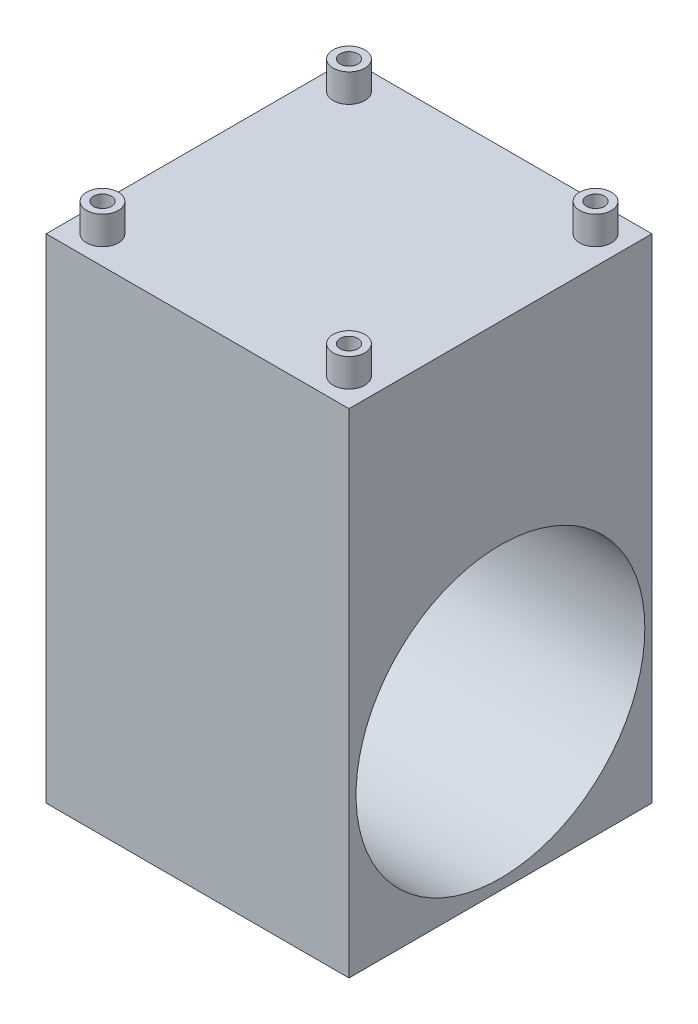
ISO-10303-21;
HEADER;
FILE_DESCRIPTION(('STEP AP214'),'2;1');
FILE_NAME('part.step','',(''),(''),'','','');
FILE_SCHEMA(('AUTOMOTIVE_DESIGN { 1 0 10303 214 1 1 1 1 }'));
ENDSEC;
DATA;
#1=APPLICATION_CONTEXT('core data for automotive mechanical design processes');
#2=APPLICATION_PROTOCOL_DEFINITION('international standard','automotive_design',2000,#1);
#3=PRODUCT_CONTEXT('',#1,'mechanical');
#4=PRODUCT('Part','Part','',(#3));
#5=PRODUCT_RELATED_PRODUCT_CATEGORY('part','',(#4));
#6=PRODUCT_DEFINITION_FORMATION('','',#4);
#7=PRODUCT_DEFINITION_CONTEXT('part definition',#1,'design');
#8=PRODUCT_DEFINITION('design','',#6,#7);
#9=PRODUCT_DEFINITION_SHAPE('','',#8);
#10=(LENGTH_UNIT() NAMED_UNIT(*) SI_UNIT(.MILLI.,.METRE.));
#11=(NAMED_UNIT(*) PLANE_ANGLE_UNIT() SI_UNIT($,.RADIAN.));
#12=(NAMED_UNIT(*) SI_UNIT($,.STERADIAN.) SOLID_ANGLE_UNIT());
#13=UNCERTAINTY_MEASURE_WITH_UNIT(LENGTH_MEASURE(1.E-05),#10,'distance_accuracy_value','');
#14=(GEOMETRIC_REPRESENTATION_CONTEXT(3) GLOBAL_UNCERTAINTY_ASSIGNED_CONTEXT((#13)) GLOBAL_UNIT_ASSIGNED_CONTEXT((#10,
#11,#12)) REPRESENTATION_CONTEXT('',''));
#15=CARTESIAN_POINT('',(0.,0.,0.));
#16=DIRECTION('',(0.,0.,1.));
#17=DIRECTION('',(1.,0.,0.));
#18=AXIS2_PLACEMENT_3D('',#15,#16,#17);
#19=CARTESIAN_POINT('',(21.5,70.,-21.5));
#20=DIRECTION('',(-1.,0.,0.));
#21=DIRECTION('',(0.,0.,1.));
#22=AXIS2_PLACEMENT_3D('',#19,#20,#21);
#23=PLANE('',#22);
#24=CARTESIAN_POINT('',(21.5,22.,0.));
#25=DIRECTION('',(1.,0.,0.));
#26=DIRECTION('',(0.,0.,-1.));
#27=AXIS2_PLACEMENT_3D('',#24,#25,#26);
#28=CIRCLE('',#27,20.5);
#29=CARTESIAN_POINT('',(21.5,22.,-20.5));
#30=VERTEX_POINT('',#29);
#31=EDGE_CURVE('E163',#30,#30,#28,.T.);
#32=ORIENTED_EDGE('',*,*,#31,.F.);
#33=EDGE_LOOP('',(#32));
#34=FACE_BOUND('',#33,.T.);
#35=DIRECTION('',(0.,0.,-1.));
#36=VECTOR('',#35,1.);
#37=CARTESIAN_POINT('',(21.5,0.,-21.5));
#38=LINE('',#37,#36);
#39=CARTESIAN_POINT('',(21.5,0.,21.5));
#40=VERTEX_POINT('',#39);
#41=CARTESIAN_POINT('',(21.5,0.,-21.5));
#42=VERTEX_POINT('',#41);
#43=EDGE_CURVE('E109',#40,#42,#38,.T.);
#44=ORIENTED_EDGE('',*,*,#43,.T.);
#45=DIRECTION('',(0.,-1.,0.));
#46=VECTOR('',#45,1.);
#47=CARTESIAN_POINT('',(21.5,70.,-21.5));
#48=LINE('',#47,#46);
#49=CARTESIAN_POINT('',(21.5,70.,-21.5));
#50=VERTEX_POINT('',#49);
#51=EDGE_CURVE('E100',#50,#42,#48,.T.);
#52=ORIENTED_EDGE('',*,*,#51,.F.);
#53=DIRECTION('',(0.,0.,-1.));
#54=VECTOR('',#53,1.);
#55=CARTESIAN_POINT('',(21.5,70.,-21.5));
#56=LINE('',#55,#54);
#57=CARTESIAN_POINT('',(21.5,70.,21.5));
#58=VERTEX_POINT('',#57);
#59=EDGE_CURVE('E94',#58,#50,#56,.T.);
#60=ORIENTED_EDGE('',*,*,#59,.F.);
#61=DIRECTION('',(0.,-1.,0.));
#62=VECTOR('',#61,1.);
#63=CARTESIAN_POINT('',(21.5,70.,21.5));
#64=LINE('',#63,#62);
#65=EDGE_CURVE('E105',#58,#40,#64,.T.);
#66=ORIENTED_EDGE('',*,*,#65,.T.);
#67=EDGE_LOOP('',(#44,#52,#60,#66));
#68=FACE_BOUND('',#67,.T.);
#69=ADVANCED_FACE('F42',(#34,#68),#23,.F.);
#70=CARTESIAN_POINT('',(-21.5,70.,-21.5));
#71=DIRECTION('',(0.,0.,1.));
#72=DIRECTION('',(1.,0.,0.));
#73=AXIS2_PLACEMENT_3D('',#70,#71,#72);
#74=PLANE('',#73);
#75=DIRECTION('',(-1.,0.,0.));
#76=VECTOR('',#75,1.);
#77=CARTESIAN_POINT('',(-21.5,0.,-21.5));
#78=LINE('',#77,#76);
#79=CARTESIAN_POINT('',(-21.5,0.,-21.5));
#80=VERTEX_POINT('',#79);
#81=EDGE_CURVE('E99',#42,#80,#78,.T.);
#82=ORIENTED_EDGE('',*,*,#81,.T.);
#83=DIRECTION('',(0.,-1.,0.));
#84=VECTOR('',#83,1.);
#85=CARTESIAN_POINT('',(-21.5,70.,-21.5));
#86=LINE('',#85,#84);
#87=CARTESIAN_POINT('',(-21.5,70.,-21.5));
#88=VERTEX_POINT('',#87);
#89=EDGE_CURVE('E97',#88,#80,#86,.T.);
#90=ORIENTED_EDGE('',*,*,#89,.F.);
#91=DIRECTION('',(-1.,0.,0.));
#92=VECTOR('',#91,1.);
#93=CARTESIAN_POINT('',(-21.5,70.,-21.5));
#94=LINE('',#93,#92);
#95=EDGE_CURVE('E89',#50,#88,#94,.T.);
#96=ORIENTED_EDGE('',*,*,#95,.F.);
#97=ORIENTED_EDGE('',*,*,#51,.T.);
#98=EDGE_LOOP('',(#82,#90,#96,#97));
#99=FACE_BOUND('',#98,.T.);
#100=ADVANCED_FACE('F98',(#99),#74,.F.);
#101=CARTESIAN_POINT('',(-21.5,70.,-21.5));
#102=DIRECTION('',(1.,0.,0.));
#103=DIRECTION('',(0.,0.,-1.));
#104=AXIS2_PLACEMENT_3D('',#101,#102,#103);
#105=PLANE('',#104);
#106=DIRECTION('',(0.,0.,1.));
#107=VECTOR('',#106,1.);
#108=CARTESIAN_POINT('',(-21.5,0.,-21.5));
#109=LINE('',#108,#107);
#110=CARTESIAN_POINT('',(-21.5,0.,21.5));
#111=VERTEX_POINT('',#110);
#112=EDGE_CURVE('E75',#80,#111,#109,.T.);
#113=ORIENTED_EDGE('',*,*,#112,.T.);
#114=DIRECTION('',(0.,-1.,0.));
#115=VECTOR('',#114,1.);
#116=CARTESIAN_POINT('',(-21.5,70.,21.5));
#117=LINE('',#116,#115);
#118=CARTESIAN_POINT('',(-21.5,70.,21.5));
#119=VERTEX_POINT('',#118);
#120=EDGE_CURVE('E101',#119,#111,#117,.T.);
#121=ORIENTED_EDGE('',*,*,#120,.F.);
#122=DIRECTION('',(0.,0.,1.));
#123=VECTOR('',#122,1.);
#124=CARTESIAN_POINT('',(-21.5,70.,-21.5));
#125=LINE('',#124,#123);
#126=EDGE_CURVE('E92',#88,#119,#125,.T.);
#127=ORIENTED_EDGE('',*,*,#126,.F.);
#128=ORIENTED_EDGE('',*,*,#89,.T.);
#129=EDGE_LOOP('',(#113,#121,#127,#128));
#130=FACE_BOUND('',#129,.T.);
#131=ADVANCED_FACE('F103',(#130),#105,.F.);
#132=CARTESIAN_POINT('',(-21.5,70.,21.5));
#133=DIRECTION('',(0.,0.,-1.));
#134=DIRECTION('',(-1.,0.,0.));
#135=AXIS2_PLACEMENT_3D('',#132,#133,#134);
#136=PLANE('',#135);
#137=DIRECTION('',(1.,0.,0.));
#138=VECTOR('',#137,1.);
#139=CARTESIAN_POINT('',(-21.5,0.,21.5));
#140=LINE('',#139,#138);
#141=EDGE_CURVE('E81',#111,#40,#140,.T.);
#142=ORIENTED_EDGE('',*,*,#141,.T.);
#143=ORIENTED_EDGE('',*,*,#65,.F.);
#144=DIRECTION('',(1.,0.,0.));
#145=VECTOR('',#144,1.);
#146=CARTESIAN_POINT('',(-21.5,70.,21.5));
#147=LINE('',#146,#145);
#148=EDGE_CURVE('E58',#119,#58,#147,.T.);
#149=ORIENTED_EDGE('',*,*,#148,.F.);
#150=ORIENTED_EDGE('',*,*,#120,.T.);
#151=EDGE_LOOP('',(#142,#143,#149,#150));
#152=FACE_BOUND('',#151,.T.);
#153=ADVANCED_FACE('F175',(#152),#136,.F.);
#154=CARTESIAN_POINT('',(0.,70.,0.));
#155=DIRECTION('',(0.,1.,0.));
#156=DIRECTION('',(0.,0.,1.));
#157=AXIS2_PLACEMENT_3D('',#154,#155,#156);
#158=PLANE('',#157);
#159=CARTESIAN_POINT('',(17.5,70.,17.5));
#160=DIRECTION('',(0.,1.,0.));
#161=DIRECTION('',(0.,0.,1.));
#162=AXIS2_PLACEMENT_3D('',#159,#160,#161);
#163=CIRCLE('',#162,2.24999999999999);
#164=CARTESIAN_POINT('',(17.5,70.,19.75));
#165=VERTEX_POINT('',#164);
#166=EDGE_CURVE('E442',#165,#165,#163,.T.);
#167=ORIENTED_EDGE('',*,*,#166,.F.);
#168=EDGE_LOOP('',(#167));
#169=FACE_BOUND('',#168,.T.);
#170=CARTESIAN_POINT('',(-17.5,70.,17.5));
#171=DIRECTION('',(0.,1.,0.));
#172=DIRECTION('',(0.,0.,1.));
#173=AXIS2_PLACEMENT_3D('',#170,#171,#172);
#174=CIRCLE('',#173,2.25000000000001);
#175=CARTESIAN_POINT('',(-17.5,70.,19.75));
#176=VERTEX_POINT('',#175);
#177=EDGE_CURVE('E433',#176,#176,#174,.T.);
#178=ORIENTED_EDGE('',*,*,#177,.F.);
#179=EDGE_LOOP('',(#178));
#180=FACE_BOUND('',#179,.T.);
#181=CARTESIAN_POINT('',(-17.5,70.,-17.5));
#182=DIRECTION('',(0.,1.,0.));
#183=DIRECTION('',(0.,0.,1.));
#184=AXIS2_PLACEMENT_3D('',#181,#182,#183);
#185=CIRCLE('',#184,2.25);
#186=CARTESIAN_POINT('',(-17.5,70.,-15.25));
#187=VERTEX_POINT('',#186);
#188=EDGE_CURVE('E424',#187,#187,#185,.T.);
#189=ORIENTED_EDGE('',*,*,#188,.F.);
#190=EDGE_LOOP('',(#189));
#191=FACE_BOUND('',#190,.T.);
#192=CARTESIAN_POINT('',(17.5,70.,-17.5));
#193=DIRECTION('',(0.,1.,0.));
#194=DIRECTION('',(0.,0.,1.));
#195=AXIS2_PLACEMENT_3D('',#192,#193,#194);
#196=CIRCLE('',#195,2.24999999999999);
#197=CARTESIAN_POINT('',(17.5,70.,-15.25));
#198=VERTEX_POINT('',#197);
#199=EDGE_CURVE('E413',#198,#198,#196,.T.);
#200=ORIENTED_EDGE('',*,*,#199,.F.);
#201=EDGE_LOOP('',(#200));
#202=FACE_BOUND('',#201,.T.);
#203=ORIENTED_EDGE('',*,*,#59,.T.);
#204=ORIENTED_EDGE('',*,*,#95,.T.);
#205=ORIENTED_EDGE('',*,*,#126,.T.);
#206=ORIENTED_EDGE('',*,*,#148,.T.);
#207=EDGE_LOOP('',(#203,#204,#205,#206));
#208=FACE_BOUND('',#207,.T.);
#209=ADVANCED_FACE('F90',(#169,#180,#191,#202,#208),#158,.T.);
#210=CARTESIAN_POINT('',(0.,0.,0.));
#211=DIRECTION('',(0.,1.,0.));
#212=DIRECTION('',(0.,0.,1.));
#213=AXIS2_PLACEMENT_3D('',#210,#211,#212);
#214=PLANE('',#213);
#215=ORIENTED_EDGE('',*,*,#43,.F.);
#216=ORIENTED_EDGE('',*,*,#141,.F.);
#217=ORIENTED_EDGE('',*,*,#112,.F.);
#218=ORIENTED_EDGE('',*,*,#81,.F.);
#219=EDGE_LOOP('',(#215,#216,#217,#218));
#220=FACE_BOUND('',#219,.T.);
#221=ADVANCED_FACE('F166',(#220),#214,.F.);
#222=CARTESIAN_POINT('',(-18.5,22.,0.));
#223=DIRECTION('',(1.,0.,0.));
#224=DIRECTION('',(0.,0.,-1.));
#225=AXIS2_PLACEMENT_3D('',#222,#223,#224);
#226=CYLINDRICAL_SURFACE('',#225,20.5);
#227=CARTESIAN_POINT('',(-18.5,22.,0.));
#228=DIRECTION('',(1.,0.,0.));
#229=DIRECTION('',(0.,0.,-1.));
#230=AXIS2_PLACEMENT_3D('',#227,#228,#229);
#231=CIRCLE('',#230,20.5);
#232=CARTESIAN_POINT('',(-18.5,22.,-20.5));
#233=VERTEX_POINT('',#232);
#234=EDGE_CURVE('E112',#233,#233,#231,.T.);
#235=ORIENTED_EDGE('',*,*,#234,.F.);
#236=EDGE_LOOP('',(#235));
#237=FACE_BOUND('',#236,.T.);
#238=ORIENTED_EDGE('',*,*,#31,.T.);
#239=EDGE_LOOP('',(#238));
#240=FACE_BOUND('',#239,.T.);
#241=ADVANCED_FACE('F168',(#237,#240),#226,.F.);
#242=CARTESIAN_POINT('',(-18.5,22.,0.));
#243=DIRECTION('',(1.,0.,0.));
#244=DIRECTION('',(0.,0.,-1.));
#245=AXIS2_PLACEMENT_3D('',#242,#243,#244);
#246=PLANE('',#245);
#247=ORIENTED_EDGE('',*,*,#234,.T.);
#248=EDGE_LOOP('',(#247));
#249=FACE_BOUND('',#248,.T.);
#250=ADVANCED_FACE('F173',(#249),#246,.T.);
#251=CARTESIAN_POINT('',(17.5,74.,-17.5));
#252=DIRECTION('',(0.,1.,0.));
#253=DIRECTION('',(0.,0.,1.));
#254=AXIS2_PLACEMENT_3D('',#251,#252,#253);
#255=PLANE('',#254);
#256=CARTESIAN_POINT('',(17.5,74.,-17.5));
#257=DIRECTION('',(0.,1.,0.));
#258=DIRECTION('',(0.,0.,1.));
#259=AXIS2_PLACEMENT_3D('',#256,#257,#258);
#260=CIRCLE('',#259,2.24999999999999);
#261=CARTESIAN_POINT('',(17.5,74.,-15.25));
#262=VERTEX_POINT('',#261);
#263=EDGE_CURVE('E410',#262,#262,#260,.T.);
#264=ORIENTED_EDGE('',*,*,#263,.T.);
#265=EDGE_LOOP('',(#264));
#266=FACE_BOUND('',#265,.T.);
#267=CARTESIAN_POINT('',(17.5,74.,-17.5));
#268=DIRECTION('',(0.,1.,0.));
#269=DIRECTION('',(0.,0.,1.));
#270=AXIS2_PLACEMENT_3D('',#267,#268,#269);
#271=CIRCLE('',#270,1.27);
#272=CARTESIAN_POINT('',(17.5,74.,-16.23));
#273=VERTEX_POINT('',#272);
#274=EDGE_CURVE('E416',#273,#273,#271,.T.);
#275=ORIENTED_EDGE('',*,*,#274,.F.);
#276=EDGE_LOOP('',(#275));
#277=FACE_BOUND('',#276,.T.);
#278=ADVANCED_FACE('F205',(#266,#277),#255,.T.);
#279=CARTESIAN_POINT('',(17.5,74.,-17.5));
#280=DIRECTION('',(0.,-1.,0.));
#281=DIRECTION('',(0.,0.,-1.));
#282=AXIS2_PLACEMENT_3D('',#279,#280,#281);
#283=CYLINDRICAL_SURFACE('',#282,2.24999999999999);
#284=ORIENTED_EDGE('',*,*,#263,.F.);
#285=EDGE_LOOP('',(#284));
#286=FACE_BOUND('',#285,.T.);
#287=ORIENTED_EDGE('',*,*,#199,.T.);
#288=EDGE_LOOP('',(#287));
#289=FACE_BOUND('',#288,.T.);
#290=ADVANCED_FACE('F210',(#286,#289),#283,.T.);
#291=CARTESIAN_POINT('',(17.5,74.,-17.5));
#292=DIRECTION('',(0.,-1.,0.));
#293=DIRECTION('',(0.,0.,-1.));
#294=AXIS2_PLACEMENT_3D('',#291,#292,#293);
#295=CYLINDRICAL_SURFACE('',#294,1.27);
#296=ORIENTED_EDGE('',*,*,#274,.T.);
#297=EDGE_LOOP('',(#296));
#298=FACE_BOUND('',#297,.T.);
#299=CARTESIAN_POINT('',(17.5,70.,-17.5));
#300=DIRECTION('',(0.,1.,0.));
#301=DIRECTION('',(0.,0.,1.));
#302=AXIS2_PLACEMENT_3D('',#299,#300,#301);
#303=CIRCLE('',#302,1.27);
#304=CARTESIAN_POINT('',(17.5,70.,-16.23));
#305=VERTEX_POINT('',#304);
#306=EDGE_CURVE('E119',#305,#305,#303,.F.);
#307=ORIENTED_EDGE('',*,*,#306,.T.);
#308=EDGE_LOOP('',(#307));
#309=FACE_BOUND('',#308,.T.);
#310=ADVANCED_FACE('F222',(#298,#309),#295,.F.);
#311=ORIENTED_EDGE('',*,*,#306,.F.);
#312=EDGE_LOOP('',(#311));
#313=FACE_BOUND('',#312,.T.);
#314=ADVANCED_FACE('F151',(#313),#158,.T.);
#315=CARTESIAN_POINT('',(-17.5,74.,-17.5));
#316=DIRECTION('',(0.,1.,0.));
#317=DIRECTION('',(0.,0.,1.));
#318=AXIS2_PLACEMENT_3D('',#315,#316,#317);
#319=PLANE('',#318);
#320=CARTESIAN_POINT('',(-17.5,74.,-17.5));
#321=DIRECTION('',(0.,1.,0.));
#322=DIRECTION('',(0.,0.,1.));
#323=AXIS2_PLACEMENT_3D('',#320,#321,#322);
#324=CIRCLE('',#323,2.25);
#325=CARTESIAN_POINT('',(-17.5,74.,-15.25));
#326=VERTEX_POINT('',#325);
#327=EDGE_CURVE('E425',#326,#326,#324,.T.);
#328=ORIENTED_EDGE('',*,*,#327,.T.);
#329=EDGE_LOOP('',(#328));
#330=FACE_BOUND('',#329,.T.);
#331=CARTESIAN_POINT('',(-17.5,74.,-17.5));
#332=DIRECTION('',(0.,1.,0.));
#333=DIRECTION('',(0.,0.,1.));
#334=AXIS2_PLACEMENT_3D('',#331,#332,#333);
#335=CIRCLE('',#334,1.27);
#336=CARTESIAN_POINT('',(-17.5,74.,-16.23));
#337=VERTEX_POINT('',#336);
#338=EDGE_CURVE('E421',#337,#337,#335,.T.);
#339=ORIENTED_EDGE('',*,*,#338,.F.);
#340=EDGE_LOOP('',(#339));
#341=FACE_BOUND('',#340,.T.);
#342=ADVANCED_FACE('F244',(#330,#341),#319,.T.);
#343=CARTESIAN_POINT('',(-17.5,74.,-17.5));
#344=DIRECTION('',(0.,-1.,0.));
#345=DIRECTION('',(0.,0.,-1.));
#346=AXIS2_PLACEMENT_3D('',#343,#344,#345);
#347=CYLINDRICAL_SURFACE('',#346,2.25);
#348=ORIENTED_EDGE('',*,*,#327,.F.);
#349=EDGE_LOOP('',(#348));
#350=FACE_BOUND('',#349,.T.);
#351=ORIENTED_EDGE('',*,*,#188,.T.);
#352=EDGE_LOOP('',(#351));
#353=FACE_BOUND('',#352,.T.);
#354=ADVANCED_FACE('F254',(#350,#353),#347,.T.);
#355=CARTESIAN_POINT('',(-17.5,74.,-17.5));
#356=DIRECTION('',(0.,-1.,0.));
#357=DIRECTION('',(0.,0.,-1.));
#358=AXIS2_PLACEMENT_3D('',#355,#356,#357);
#359=CYLINDRICAL_SURFACE('',#358,1.27);
#360=ORIENTED_EDGE('',*,*,#338,.T.);
#361=EDGE_LOOP('',(#360));
#362=FACE_BOUND('',#361,.T.);
#363=CARTESIAN_POINT('',(-17.5,70.,-17.5));
#364=DIRECTION('',(0.,1.,0.));
#365=DIRECTION('',(0.,0.,1.));
#366=AXIS2_PLACEMENT_3D('',#363,#364,#365);
#367=CIRCLE('',#366,1.27);
#368=CARTESIAN_POINT('',(-17.5,70.,-16.23));
#369=VERTEX_POINT('',#368);
#370=EDGE_CURVE('E122',#369,#369,#367,.F.);
#371=ORIENTED_EDGE('',*,*,#370,.T.);
#372=EDGE_LOOP('',(#371));
#373=FACE_BOUND('',#372,.T.);
#374=ADVANCED_FACE('F149',(#362,#373),#359,.F.);
#375=ORIENTED_EDGE('',*,*,#370,.F.);
#376=EDGE_LOOP('',(#375));
#377=FACE_BOUND('',#376,.T.);
#378=ADVANCED_FACE('F133',(#377),#158,.T.);
#379=CARTESIAN_POINT('',(-17.5,74.,17.5));
#380=DIRECTION('',(0.,1.,0.));
#381=DIRECTION('',(0.,0.,1.));
#382=AXIS2_PLACEMENT_3D('',#379,#380,#381);
#383=PLANE('',#382);
#384=CARTESIAN_POINT('',(-17.5,74.,17.5));
#385=DIRECTION('',(0.,1.,0.));
#386=DIRECTION('',(0.,0.,1.));
#387=AXIS2_PLACEMENT_3D('',#384,#385,#386);
#388=CIRCLE('',#387,2.25000000000001);
#389=CARTESIAN_POINT('',(-17.5,74.,19.75));
#390=VERTEX_POINT('',#389);
#391=EDGE_CURVE('E434',#390,#390,#388,.T.);
#392=ORIENTED_EDGE('',*,*,#391,.T.);
#393=EDGE_LOOP('',(#392));
#394=FACE_BOUND('',#393,.T.);
#395=CARTESIAN_POINT('',(-17.5,74.,17.5));
#396=DIRECTION('',(0.,1.,0.));
#397=DIRECTION('',(0.,0.,1.));
#398=AXIS2_PLACEMENT_3D('',#395,#396,#397);
#399=CIRCLE('',#398,1.27);
#400=CARTESIAN_POINT('',(-17.5,74.,18.77));
#401=VERTEX_POINT('',#400);
#402=EDGE_CURVE('E428',#401,#401,#399,.T.);
#403=ORIENTED_EDGE('',*,*,#402,.F.);
#404=EDGE_LOOP('',(#403));
#405=FACE_BOUND('',#404,.T.);
#406=ADVANCED_FACE('F148',(#394,#405),#383,.T.);
#407=CARTESIAN_POINT('',(-17.5,74.,17.5));
#408=DIRECTION('',(0.,-1.,0.));
#409=DIRECTION('',(0.,0.,-1.));
#410=AXIS2_PLACEMENT_3D('',#407,#408,#409);
#411=CYLINDRICAL_SURFACE('',#410,2.25000000000001);
#412=ORIENTED_EDGE('',*,*,#391,.F.);
#413=EDGE_LOOP('',(#412));
#414=FACE_BOUND('',#413,.T.);
#415=ORIENTED_EDGE('',*,*,#177,.T.);
#416=EDGE_LOOP('',(#415));
#417=FACE_BOUND('',#416,.T.);
#418=ADVANCED_FACE('F142',(#414,#417),#411,.T.);
#419=CARTESIAN_POINT('',(-17.5,74.,17.5));
#420=DIRECTION('',(0.,-1.,0.));
#421=DIRECTION('',(0.,0.,-1.));
#422=AXIS2_PLACEMENT_3D('',#419,#420,#421);
#423=CYLINDRICAL_SURFACE('',#422,1.27);
#424=ORIENTED_EDGE('',*,*,#402,.T.);
#425=EDGE_LOOP('',(#424));
#426=FACE_BOUND('',#425,.T.);
#427=CARTESIAN_POINT('',(-17.5,70.,17.5));
#428=DIRECTION('',(0.,1.,0.));
#429=DIRECTION('',(0.,0.,1.));
#430=AXIS2_PLACEMENT_3D('',#427,#428,#429);
#431=CIRCLE('',#430,1.27);
#432=CARTESIAN_POINT('',(-17.5,70.,18.77));
#433=VERTEX_POINT('',#432);
#434=EDGE_CURVE('E50',#433,#433,#431,.F.);
#435=ORIENTED_EDGE('',*,*,#434,.T.);
#436=EDGE_LOOP('',(#435));
#437=FACE_BOUND('',#436,.T.);
#438=ADVANCED_FACE('F127',(#426,#437),#423,.F.);
#439=ORIENTED_EDGE('',*,*,#434,.F.);
#440=EDGE_LOOP('',(#439));
#441=FACE_BOUND('',#440,.T.);
#442=ADVANCED_FACE('F129',(#441),#158,.T.);
#443=CARTESIAN_POINT('',(17.5,74.,17.5));
#444=DIRECTION('',(0.,1.,0.));
#445=DIRECTION('',(0.,0.,1.));
#446=AXIS2_PLACEMENT_3D('',#443,#444,#445);
#447=PLANE('',#446);
#448=CARTESIAN_POINT('',(17.5,74.,17.5));
#449=DIRECTION('',(0.,1.,0.));
#450=DIRECTION('',(0.,0.,1.));
#451=AXIS2_PLACEMENT_3D('',#448,#449,#450);
#452=CIRCLE('',#451,2.24999999999999);
#453=CARTESIAN_POINT('',(17.5,74.,19.75));
#454=VERTEX_POINT('',#453);
#455=EDGE_CURVE('E443',#454,#454,#452,.T.);
#456=ORIENTED_EDGE('',*,*,#455,.T.);
#457=EDGE_LOOP('',(#456));
#458=FACE_BOUND('',#457,.T.);
#459=CARTESIAN_POINT('',(17.5,74.,17.5));
#460=DIRECTION('',(0.,1.,0.));
#461=DIRECTION('',(0.,0.,1.));
#462=AXIS2_PLACEMENT_3D('',#459,#460,#461);
#463=CIRCLE('',#462,1.27);
#464=CARTESIAN_POINT('',(17.5,74.,18.77));
#465=VERTEX_POINT('',#464);
#466=EDGE_CURVE('E437',#465,#465,#463,.T.);
#467=ORIENTED_EDGE('',*,*,#466,.F.);
#468=EDGE_LOOP('',(#467));
#469=FACE_BOUND('',#468,.T.);
#470=ADVANCED_FACE('F131',(#458,#469),#447,.T.);
#471=CARTESIAN_POINT('',(17.5,74.,17.5));
#472=DIRECTION('',(0.,-1.,0.));
#473=DIRECTION('',(0.,0.,-1.));
#474=AXIS2_PLACEMENT_3D('',#471,#472,#473);
#475=CYLINDRICAL_SURFACE('',#474,2.24999999999999);
#476=ORIENTED_EDGE('',*,*,#455,.F.);
#477=EDGE_LOOP('',(#476));
#478=FACE_BOUND('',#477,.T.);
#479=ORIENTED_EDGE('',*,*,#166,.T.);
#480=EDGE_LOOP('',(#479));
#481=FACE_BOUND('',#480,.T.);
#482=ADVANCED_FACE('F139',(#478,#481),#475,.T.);
#483=CARTESIAN_POINT('',(17.5,74.,17.5));
#484=DIRECTION('',(0.,-1.,0.));
#485=DIRECTION('',(0.,0.,-1.));
#486=AXIS2_PLACEMENT_3D('',#483,#484,#485);
#487=CYLINDRICAL_SURFACE('',#486,1.27);
#488=ORIENTED_EDGE('',*,*,#466,.T.);
#489=EDGE_LOOP('',(#488));
#490=FACE_BOUND('',#489,.T.);
#491=CARTESIAN_POINT('',(17.5,70.,17.5));
#492=DIRECTION('',(0.,1.,0.));
#493=DIRECTION('',(0.,0.,1.));
#494=AXIS2_PLACEMENT_3D('',#491,#492,#493);
#495=CIRCLE('',#494,1.27);
#496=CARTESIAN_POINT('',(17.5,70.,18.77));
#497=VERTEX_POINT('',#496);
#498=EDGE_CURVE('E11',#497,#497,#495,.F.);
#499=ORIENTED_EDGE('',*,*,#498,.T.);
#500=EDGE_LOOP('',(#499));
#501=FACE_BOUND('',#500,.T.);
#502=ADVANCED_FACE('F153',(#490,#501),#487,.F.);
#503=ORIENTED_EDGE('',*,*,#498,.F.);
#504=EDGE_LOOP('',(#503));
#505=FACE_BOUND('',#504,.T.);
#506=ADVANCED_FACE('F134',(#505),#158,.T.);
#507=CLOSED_SHELL('',(#69,#100,#131,#153,#209,#221,#241,#250,#278,#290,#310,#314,#342,#354,#374,
#378,#406,#418,#438,#442,#470,#482,#502,#506));
#508=MANIFOLD_SOLID_BREP('B2',#507);
#509=ADVANCED_BREP_SHAPE_REPRESENTATION('',(#18,#508),#14);
#510=SHAPE_DEFINITION_REPRESENTATION(#9,#509);
ENDSEC;
END-ISO-10303-21;
